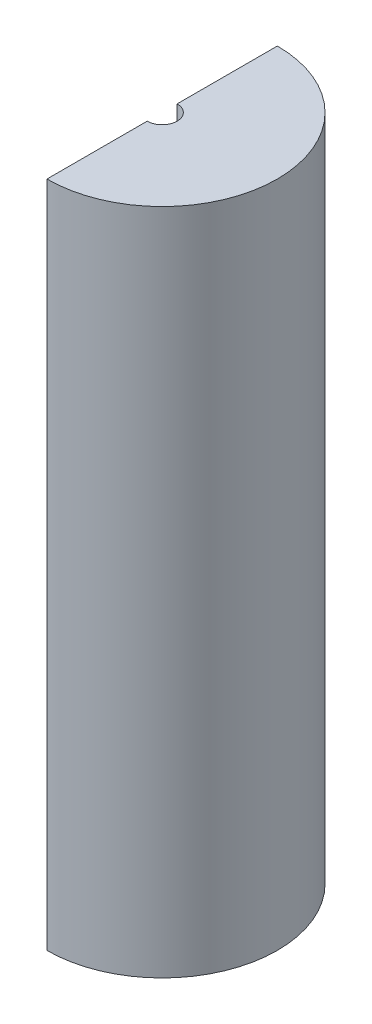
ISO-10303-21;
HEADER;
FILE_DESCRIPTION(('STEP AP214'),'2;1');
FILE_NAME('part.step','',(''),(''),'','','');
FILE_SCHEMA(('AUTOMOTIVE_DESIGN { 1 0 10303 214 1 1 1 1 }'));
ENDSEC;
DATA;
#1=APPLICATION_CONTEXT('core data for automotive mechanical design processes');
#2=APPLICATION_PROTOCOL_DEFINITION('international standard','automotive_design',2000,#1);
#3=PRODUCT_CONTEXT('',#1,'mechanical');
#4=PRODUCT('Part','Part','',(#3));
#5=PRODUCT_RELATED_PRODUCT_CATEGORY('part','',(#4));
#6=PRODUCT_DEFINITION_FORMATION('','',#4);
#7=PRODUCT_DEFINITION_CONTEXT('part definition',#1,'design');
#8=PRODUCT_DEFINITION('design','',#6,#7);
#9=PRODUCT_DEFINITION_SHAPE('','',#8);
#10=(LENGTH_UNIT() NAMED_UNIT(*) SI_UNIT(.MILLI.,.METRE.));
#11=(NAMED_UNIT(*) PLANE_ANGLE_UNIT() SI_UNIT($,.RADIAN.));
#12=(NAMED_UNIT(*) SI_UNIT($,.STERADIAN.) SOLID_ANGLE_UNIT());
#13=UNCERTAINTY_MEASURE_WITH_UNIT(LENGTH_MEASURE(1.E-05),#10,'distance_accuracy_value','');
#14=(GEOMETRIC_REPRESENTATION_CONTEXT(3) GLOBAL_UNCERTAINTY_ASSIGNED_CONTEXT((#13)) GLOBAL_UNIT_ASSIGNED_CONTEXT((#10,
#11,#12)) REPRESENTATION_CONTEXT('',''));
#15=CARTESIAN_POINT('',(0.,0.,0.));
#16=DIRECTION('',(0.,0.,1.));
#17=DIRECTION('',(1.,0.,0.));
#18=AXIS2_PLACEMENT_3D('',#15,#16,#17);
#19=CARTESIAN_POINT('',(0.,2.,-0.344895788082818));
#20=DIRECTION('',(0.,-1.,0.));
#21=DIRECTION('',(0.,0.,-1.));
#22=AXIS2_PLACEMENT_3D('',#19,#20,#21);
#23=CYLINDRICAL_SURFACE('',#22,0.344895788082818);
#24=CARTESIAN_POINT('',(0.,0.,-0.344895788082818));
#25=DIRECTION('',(0.,1.,0.));
#26=DIRECTION('',(0.,0.,1.));
#27=AXIS2_PLACEMENT_3D('',#24,#25,#26);
#28=CIRCLE('',#27,0.344895788082818);
#29=CARTESIAN_POINT('',(0.,0.,0.));
#30=VERTEX_POINT('',#29);
#31=CARTESIAN_POINT('',(0.,0.,-0.689791576165636));
#32=VERTEX_POINT('',#31);
#33=EDGE_CURVE('E98',#30,#32,#28,.T.);
#34=ORIENTED_EDGE('',*,*,#33,.T.);
#35=DIRECTION('',(0.,-1.,0.));
#36=VECTOR('',#35,1.);
#37=CARTESIAN_POINT('',(0.,2.,-0.689791576165636));
#38=LINE('',#37,#36);
#39=CARTESIAN_POINT('',(0.,2.,-0.689791576165636));
#40=VERTEX_POINT('',#39);
#41=EDGE_CURVE('E11',#40,#32,#38,.T.);
#42=ORIENTED_EDGE('',*,*,#41,.F.);
#43=CARTESIAN_POINT('',(0.,2.,-0.344895788082818));
#44=DIRECTION('',(0.,1.,0.));
#45=DIRECTION('',(0.,0.,1.));
#46=AXIS2_PLACEMENT_3D('',#43,#44,#45);
#47=CIRCLE('',#46,0.344895788082818);
#48=CARTESIAN_POINT('',(0.,2.,0.));
#49=VERTEX_POINT('',#48);
#50=EDGE_CURVE('E86',#49,#40,#47,.T.);
#51=ORIENTED_EDGE('',*,*,#50,.F.);
#52=DIRECTION('',(0.,-1.,0.));
#53=VECTOR('',#52,1.);
#54=CARTESIAN_POINT('',(0.,2.,0.));
#55=LINE('',#54,#53);
#56=EDGE_CURVE('E94',#49,#30,#55,.T.);
#57=ORIENTED_EDGE('',*,*,#56,.T.);
#58=EDGE_LOOP('',(#34,#42,#51,#57));
#59=FACE_BOUND('',#58,.T.);
#60=ADVANCED_FACE('F35',(#59),#23,.T.);
#61=CARTESIAN_POINT('',(0.,2.,-0.389791576165636));
#62=DIRECTION('',(1.,0.,0.));
#63=DIRECTION('',(0.,0.,-1.));
#64=AXIS2_PLACEMENT_3D('',#61,#62,#63);
#65=PLANE('',#64);
#66=DIRECTION('',(0.,0.,1.));
#67=VECTOR('',#66,1.);
#68=CARTESIAN_POINT('',(0.,0.,-0.389791576165636));
#69=LINE('',#68,#67);
#70=CARTESIAN_POINT('',(0.,0.,-0.389791576165636));
#71=VERTEX_POINT('',#70);
#72=EDGE_CURVE('E90',#32,#71,#69,.T.);
#73=ORIENTED_EDGE('',*,*,#72,.T.);
#74=DIRECTION('',(0.,-1.,0.));
#75=VECTOR('',#74,1.);
#76=CARTESIAN_POINT('',(0.,2.,-0.389791576165636));
#77=LINE('',#76,#75);
#78=CARTESIAN_POINT('',(0.,2.,-0.389791576165636));
#79=VERTEX_POINT('',#78);
#80=EDGE_CURVE('E43',#79,#71,#77,.T.);
#81=ORIENTED_EDGE('',*,*,#80,.F.);
#82=DIRECTION('',(0.,0.,1.));
#83=VECTOR('',#82,1.);
#84=CARTESIAN_POINT('',(0.,2.,-0.389791576165636));
#85=LINE('',#84,#83);
#86=EDGE_CURVE('E81',#40,#79,#85,.T.);
#87=ORIENTED_EDGE('',*,*,#86,.F.);
#88=ORIENTED_EDGE('',*,*,#41,.T.);
#89=EDGE_LOOP('',(#73,#81,#87,#88));
#90=FACE_BOUND('',#89,.T.);
#91=ADVANCED_FACE('F89',(#90),#65,.F.);
#92=CARTESIAN_POINT('',(0.,2.,-0.344895788082818));
#93=DIRECTION('',(0.,-1.,0.));
#94=DIRECTION('',(0.,0.,-1.));
#95=AXIS2_PLACEMENT_3D('',#92,#93,#94);
#96=CYLINDRICAL_SURFACE('',#95,0.0448957880828179);
#97=CARTESIAN_POINT('',(0.,0.,-0.344895788082818));
#98=DIRECTION('',(0.,-1.,0.));
#99=DIRECTION('',(0.,0.,1.));
#100=AXIS2_PLACEMENT_3D('',#97,#98,#99);
#101=CIRCLE('',#100,0.0448957880828179);
#102=CARTESIAN_POINT('',(0.,0.,-0.3));
#103=VERTEX_POINT('',#102);
#104=EDGE_CURVE('E68',#71,#103,#101,.T.);
#105=ORIENTED_EDGE('',*,*,#104,.T.);
#106=DIRECTION('',(0.,-1.,0.));
#107=VECTOR('',#106,1.);
#108=CARTESIAN_POINT('',(0.,2.,-0.3));
#109=LINE('',#108,#107);
#110=CARTESIAN_POINT('',(0.,2.,-0.3));
#111=VERTEX_POINT('',#110);
#112=EDGE_CURVE('E91',#111,#103,#109,.T.);
#113=ORIENTED_EDGE('',*,*,#112,.F.);
#114=CARTESIAN_POINT('',(0.,2.,-0.344895788082818));
#115=DIRECTION('',(0.,-1.,0.));
#116=DIRECTION('',(0.,0.,1.));
#117=AXIS2_PLACEMENT_3D('',#114,#115,#116);
#118=CIRCLE('',#117,0.0448957880828179);
#119=EDGE_CURVE('E84',#79,#111,#118,.T.);
#120=ORIENTED_EDGE('',*,*,#119,.F.);
#121=ORIENTED_EDGE('',*,*,#80,.T.);
#122=EDGE_LOOP('',(#105,#113,#120,#121));
#123=FACE_BOUND('',#122,.T.);
#124=ADVANCED_FACE('F92',(#123),#96,.F.);
#125=CARTESIAN_POINT('',(0.,2.,0.));
#126=DIRECTION('',(1.,0.,0.));
#127=DIRECTION('',(0.,0.,-1.));
#128=AXIS2_PLACEMENT_3D('',#125,#126,#127);
#129=PLANE('',#128);
#130=DIRECTION('',(0.,0.,1.));
#131=VECTOR('',#130,1.);
#132=CARTESIAN_POINT('',(0.,0.,0.));
#133=LINE('',#132,#131);
#134=EDGE_CURVE('E74',#103,#30,#133,.T.);
#135=ORIENTED_EDGE('',*,*,#134,.T.);
#136=ORIENTED_EDGE('',*,*,#56,.F.);
#137=DIRECTION('',(0.,0.,1.));
#138=VECTOR('',#137,1.);
#139=CARTESIAN_POINT('',(0.,2.,0.));
#140=LINE('',#139,#138);
#141=EDGE_CURVE('E51',#111,#49,#140,.T.);
#142=ORIENTED_EDGE('',*,*,#141,.F.);
#143=ORIENTED_EDGE('',*,*,#112,.T.);
#144=EDGE_LOOP('',(#135,#136,#142,#143));
#145=FACE_BOUND('',#144,.T.);
#146=ADVANCED_FACE('F105',(#145),#129,.F.);
#147=CARTESIAN_POINT('',(0.,2.,-0.344895788082818));
#148=DIRECTION('',(0.,1.,0.));
#149=DIRECTION('',(0.,0.,1.));
#150=AXIS2_PLACEMENT_3D('',#147,#148,#149);
#151=PLANE('',#150);
#152=ORIENTED_EDGE('',*,*,#50,.T.);
#153=ORIENTED_EDGE('',*,*,#86,.T.);
#154=ORIENTED_EDGE('',*,*,#119,.T.);
#155=ORIENTED_EDGE('',*,*,#141,.T.);
#156=EDGE_LOOP('',(#152,#153,#154,#155));
#157=FACE_BOUND('',#156,.T.);
#158=ADVANCED_FACE('F82',(#157),#151,.T.);
#159=CARTESIAN_POINT('',(0.,0.,-0.344895788082818));
#160=DIRECTION('',(0.,1.,0.));
#161=DIRECTION('',(0.,0.,1.));
#162=AXIS2_PLACEMENT_3D('',#159,#160,#161);
#163=PLANE('',#162);
#164=ORIENTED_EDGE('',*,*,#33,.F.);
#165=ORIENTED_EDGE('',*,*,#134,.F.);
#166=ORIENTED_EDGE('',*,*,#104,.F.);
#167=ORIENTED_EDGE('',*,*,#72,.F.);
#168=EDGE_LOOP('',(#164,#165,#166,#167));
#169=FACE_BOUND('',#168,.T.);
#170=ADVANCED_FACE('F108',(#169),#163,.F.);
#171=CLOSED_SHELL('',(#60,#91,#124,#146,#158,#170));
#172=MANIFOLD_SOLID_BREP('B2',#171);
#173=ADVANCED_BREP_SHAPE_REPRESENTATION('',(#18,#172),#14);
#174=SHAPE_DEFINITION_REPRESENTATION(#9,#173);
ENDSEC;
END-ISO-10303-21;
